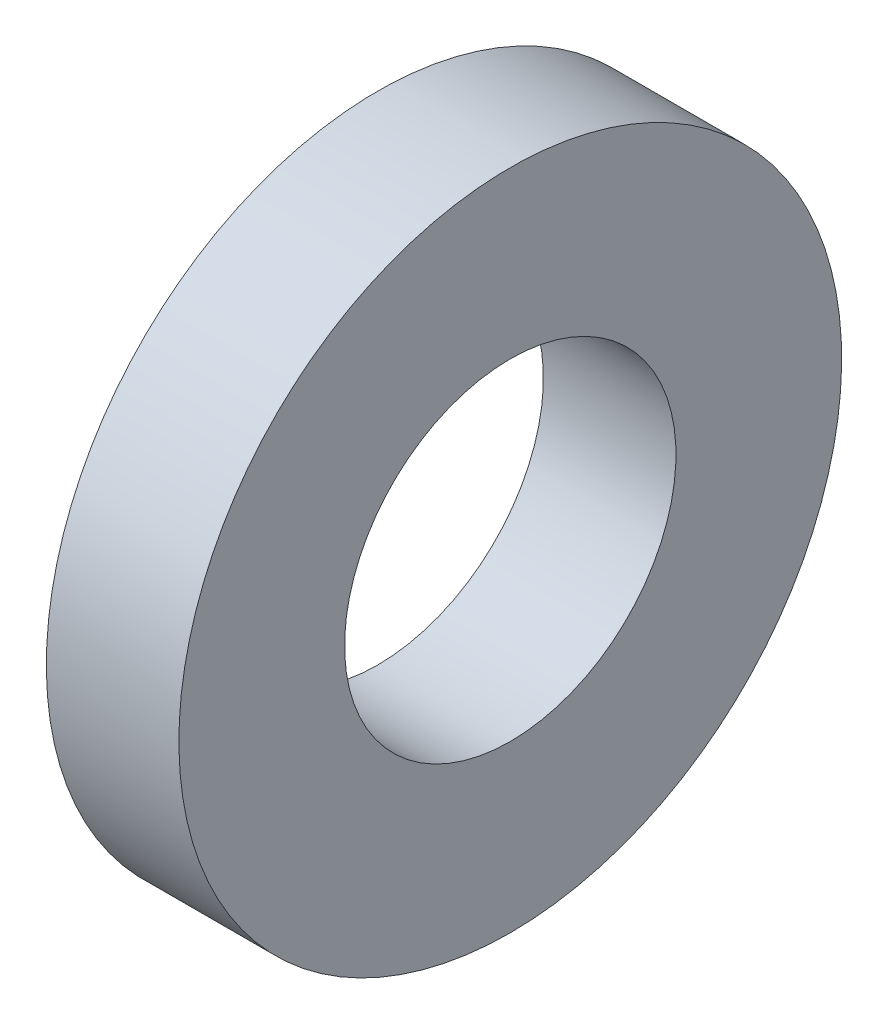
ISO-10303-21;
HEADER;
FILE_DESCRIPTION(('STEP AP214'),'2;1');
FILE_NAME('part.step','',(''),(''),'','','');
FILE_SCHEMA(('AUTOMOTIVE_DESIGN { 1 0 10303 214 1 1 1 1 }'));
ENDSEC;
DATA;
#1=APPLICATION_CONTEXT('core data for automotive mechanical design processes');
#2=APPLICATION_PROTOCOL_DEFINITION('international standard','automotive_design',2000,#1);
#3=PRODUCT_CONTEXT('',#1,'mechanical');
#4=PRODUCT('Part','Part','',(#3));
#5=PRODUCT_RELATED_PRODUCT_CATEGORY('part','',(#4));
#6=PRODUCT_DEFINITION_FORMATION('','',#4);
#7=PRODUCT_DEFINITION_CONTEXT('part definition',#1,'design');
#8=PRODUCT_DEFINITION('design','',#6,#7);
#9=PRODUCT_DEFINITION_SHAPE('','',#8);
#10=(LENGTH_UNIT() NAMED_UNIT(*) SI_UNIT(.MILLI.,.METRE.));
#11=(NAMED_UNIT(*) PLANE_ANGLE_UNIT() SI_UNIT($,.RADIAN.));
#12=(NAMED_UNIT(*) SI_UNIT($,.STERADIAN.) SOLID_ANGLE_UNIT());
#13=UNCERTAINTY_MEASURE_WITH_UNIT(LENGTH_MEASURE(1.E-05),#10,'distance_accuracy_value','');
#14=(GEOMETRIC_REPRESENTATION_CONTEXT(3) GLOBAL_UNCERTAINTY_ASSIGNED_CONTEXT((#13)) GLOBAL_UNIT_ASSIGNED_CONTEXT((#10,
#11,#12)) REPRESENTATION_CONTEXT('',''));
#15=CARTESIAN_POINT('',(0.,0.,0.));
#16=DIRECTION('',(0.,0.,1.));
#17=DIRECTION('',(1.,0.,0.));
#18=AXIS2_PLACEMENT_3D('',#15,#16,#17);
#19=CARTESIAN_POINT('',(50.927,-82.55,812.8));
#20=DIRECTION('',(-1.,0.,0.));
#21=DIRECTION('',(0.,-1.,0.));
#22=AXIS2_PLACEMENT_3D('',#19,#20,#21);
#23=PLANE('',#22);
#24=CARTESIAN_POINT('',(50.927,-82.55,812.8));
#25=DIRECTION('',(-1.,0.,0.));
#26=DIRECTION('',(0.,-1.,0.));
#27=AXIS2_PLACEMENT_3D('',#24,#25,#26);
#28=CIRCLE('',#27,15.875);
#29=CARTESIAN_POINT('',(50.927,-98.4249999999999,812.8));
#30=VERTEX_POINT('',#29);
#31=EDGE_CURVE('E10',#30,#30,#28,.T.);
#32=ORIENTED_EDGE('',*,*,#31,.T.);
#33=EDGE_LOOP('',(#32));
#34=FACE_BOUND('',#33,.T.);
#35=CARTESIAN_POINT('',(50.927,-82.55,812.8));
#36=DIRECTION('',(-1.,0.,0.));
#37=DIRECTION('',(0.,-1.,0.));
#38=AXIS2_PLACEMENT_3D('',#35,#36,#37);
#39=CIRCLE('',#38,7.93750000000009);
#40=CARTESIAN_POINT('',(50.927,-90.4875000000001,812.8));
#41=VERTEX_POINT('',#40);
#42=EDGE_CURVE('E45',#41,#41,#39,.T.);
#43=ORIENTED_EDGE('',*,*,#42,.F.);
#44=EDGE_LOOP('',(#43));
#45=FACE_BOUND('',#44,.T.);
#46=ADVANCED_FACE('F34',(#34,#45),#23,.T.);
#47=CARTESIAN_POINT('',(57.277,-82.55,812.8));
#48=DIRECTION('',(-1.,0.,0.));
#49=DIRECTION('',(0.,-1.,0.));
#50=AXIS2_PLACEMENT_3D('',#47,#48,#49);
#51=PLANE('',#50);
#52=CARTESIAN_POINT('',(57.277,-82.55,812.8));
#53=DIRECTION('',(-1.,0.,0.));
#54=DIRECTION('',(0.,-1.,0.));
#55=AXIS2_PLACEMENT_3D('',#52,#53,#54);
#56=CIRCLE('',#55,15.875);
#57=CARTESIAN_POINT('',(57.277,-98.4249999999999,812.8));
#58=VERTEX_POINT('',#57);
#59=EDGE_CURVE('E38',#58,#58,#56,.T.);
#60=ORIENTED_EDGE('',*,*,#59,.F.);
#61=EDGE_LOOP('',(#60));
#62=FACE_BOUND('',#61,.T.);
#63=CARTESIAN_POINT('',(57.277,-82.55,812.8));
#64=DIRECTION('',(-1.,0.,0.));
#65=DIRECTION('',(0.,-1.,0.));
#66=AXIS2_PLACEMENT_3D('',#63,#64,#65);
#67=CIRCLE('',#66,7.93750000000009);
#68=CARTESIAN_POINT('',(57.277,-90.4875000000001,812.8));
#69=VERTEX_POINT('',#68);
#70=EDGE_CURVE('E47',#69,#69,#67,.T.);
#71=ORIENTED_EDGE('',*,*,#70,.T.);
#72=EDGE_LOOP('',(#71));
#73=FACE_BOUND('',#72,.T.);
#74=ADVANCED_FACE('F57',(#62,#73),#51,.F.);
#75=CARTESIAN_POINT('',(50.927,-82.55,812.8));
#76=DIRECTION('',(1.,0.,0.));
#77=DIRECTION('',(0.,1.,0.));
#78=AXIS2_PLACEMENT_3D('',#75,#76,#77);
#79=CYLINDRICAL_SURFACE('',#78,15.875);
#80=ORIENTED_EDGE('',*,*,#31,.F.);
#81=EDGE_LOOP('',(#80));
#82=FACE_BOUND('',#81,.T.);
#83=ORIENTED_EDGE('',*,*,#59,.T.);
#84=EDGE_LOOP('',(#83));
#85=FACE_BOUND('',#84,.T.);
#86=ADVANCED_FACE('F36',(#82,#85),#79,.T.);
#87=CARTESIAN_POINT('',(50.927,-82.55,812.8));
#88=DIRECTION('',(1.,0.,0.));
#89=DIRECTION('',(0.,1.,0.));
#90=AXIS2_PLACEMENT_3D('',#87,#88,#89);
#91=CYLINDRICAL_SURFACE('',#90,7.93750000000009);
#92=ORIENTED_EDGE('',*,*,#42,.T.);
#93=EDGE_LOOP('',(#92));
#94=FACE_BOUND('',#93,.T.);
#95=ORIENTED_EDGE('',*,*,#70,.F.);
#96=EDGE_LOOP('',(#95));
#97=FACE_BOUND('',#96,.T.);
#98=ADVANCED_FACE('F53',(#94,#97),#91,.F.);
#99=CLOSED_SHELL('',(#46,#74,#86,#98));
#100=MANIFOLD_SOLID_BREP('B2',#99);
#101=ADVANCED_BREP_SHAPE_REPRESENTATION('',(#18,#100),#14);
#102=SHAPE_DEFINITION_REPRESENTATION(#9,#101);
ENDSEC;
END-ISO-10303-21;
